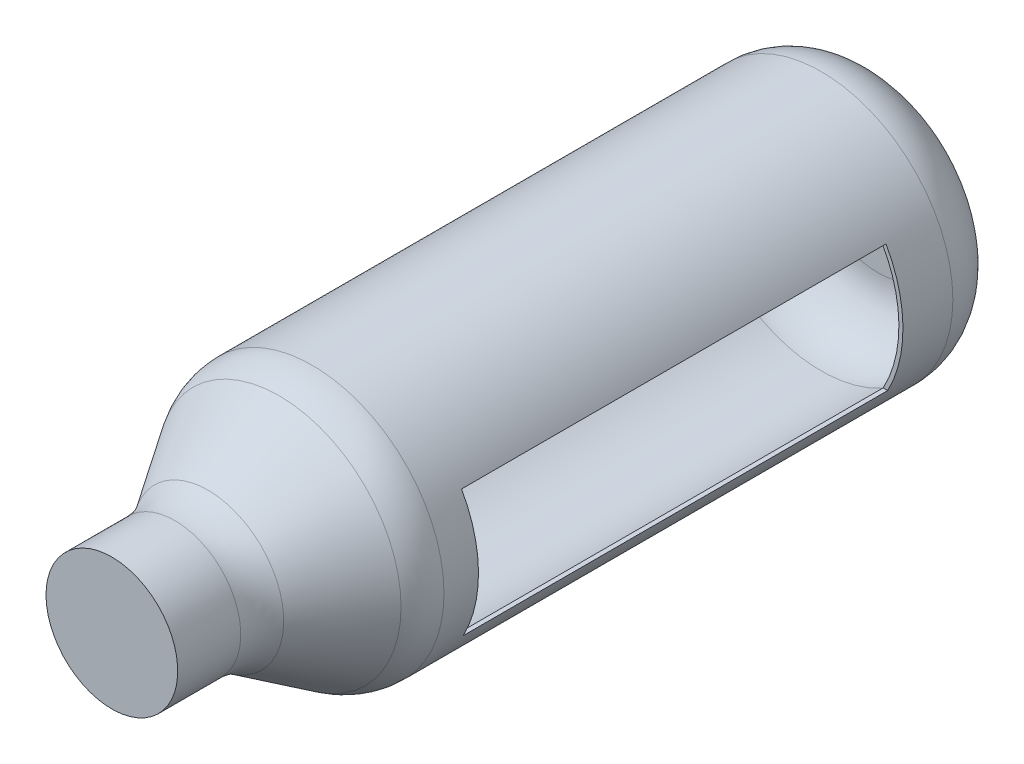
ISO-10303-21;
HEADER;
FILE_DESCRIPTION(('STEP AP214'),'2;1');
FILE_NAME('part.step','',(''),(''),'','','');
FILE_SCHEMA(('AUTOMOTIVE_DESIGN { 1 0 10303 214 1 1 1 1 }'));
ENDSEC;
DATA;
#1=APPLICATION_CONTEXT('core data for automotive mechanical design processes');
#2=APPLICATION_PROTOCOL_DEFINITION('international standard','automotive_design',2000,#1);
#3=PRODUCT_CONTEXT('',#1,'mechanical');
#4=PRODUCT('Part','Part','',(#3));
#5=PRODUCT_RELATED_PRODUCT_CATEGORY('part','',(#4));
#6=PRODUCT_DEFINITION_FORMATION('','',#4);
#7=PRODUCT_DEFINITION_CONTEXT('part definition',#1,'design');
#8=PRODUCT_DEFINITION('design','',#6,#7);
#9=PRODUCT_DEFINITION_SHAPE('','',#8);
#10=(LENGTH_UNIT() NAMED_UNIT(*) SI_UNIT(.MILLI.,.METRE.));
#11=(NAMED_UNIT(*) PLANE_ANGLE_UNIT() SI_UNIT($,.RADIAN.));
#12=(NAMED_UNIT(*) SI_UNIT($,.STERADIAN.) SOLID_ANGLE_UNIT());
#13=UNCERTAINTY_MEASURE_WITH_UNIT(LENGTH_MEASURE(1.E-05),#10,'distance_accuracy_value','');
#14=(GEOMETRIC_REPRESENTATION_CONTEXT(3) GLOBAL_UNCERTAINTY_ASSIGNED_CONTEXT((#13)) GLOBAL_UNIT_ASSIGNED_CONTEXT((#10,
#11,#12)) REPRESENTATION_CONTEXT('',''));
#15=CARTESIAN_POINT('',(0.,0.,0.));
#16=DIRECTION('',(0.,0.,1.));
#17=DIRECTION('',(1.,0.,0.));
#18=AXIS2_PLACEMENT_3D('',#15,#16,#17);
#19=CARTESIAN_POINT('',(0.,15.25,189.));
#20=DIRECTION('',(0.,0.,-1.));
#21=DIRECTION('',(-1.,0.,0.));
#22=AXIS2_PLACEMENT_3D('',#19,#20,#21);
#23=PLANE('',#22);
#24=CARTESIAN_POINT('',(0.,0.,189.));
#25=DIRECTION('',(0.,0.,-1.));
#26=DIRECTION('',(-1.,0.,0.));
#27=AXIS2_PLACEMENT_3D('',#24,#25,#26);
#28=CIRCLE('',#27,15.25);
#29=CARTESIAN_POINT('',(-15.25,0.,189.));
#30=VERTEX_POINT('',#29);
#31=EDGE_CURVE('E120',#30,#30,#28,.T.);
#32=ORIENTED_EDGE('',*,*,#31,.T.);
#33=EDGE_LOOP('',(#32));
#34=FACE_BOUND('',#33,.T.);
#35=ADVANCED_FACE('F39',(#34),#23,.T.);
#36=CARTESIAN_POINT('',(0.,0.,0.));
#37=DIRECTION('',(0.,0.,-1.));
#38=DIRECTION('',(-1.,0.,0.));
#39=AXIS2_PLACEMENT_3D('',#36,#37,#38);
#40=CYLINDRICAL_SURFACE('',#39,15.25);
#41=CARTESIAN_POINT('',(0.,0.,174.446601019715));
#42=DIRECTION('',(0.,0.,-1.));
#43=DIRECTION('',(-1.,0.,0.));
#44=AXIS2_PLACEMENT_3D('',#41,#42,#43);
#45=CIRCLE('',#44,15.25);
#46=CARTESIAN_POINT('',(-15.25,0.,174.446601019715));
#47=VERTEX_POINT('',#46);
#48=EDGE_CURVE('E123',#47,#47,#45,.T.);
#49=ORIENTED_EDGE('',*,*,#48,.T.);
#50=EDGE_LOOP('',(#49));
#51=FACE_BOUND('',#50,.T.);
#52=ORIENTED_EDGE('',*,*,#31,.F.);
#53=EDGE_LOOP('',(#52));
#54=FACE_BOUND('',#53,.T.);
#55=ADVANCED_FACE('F170',(#51,#54),#40,.F.);
#56=CARTESIAN_POINT('',(0.,0.,174.446601019715));
#57=DIRECTION('',(0.,0.,-1.));
#58=DIRECTION('',(-1.,0.,0.));
#59=AXIS2_PLACEMENT_3D('',#56,#57,#58);
#60=TOROIDAL_SURFACE('',#59,31.25,16.);
#61=CARTESIAN_POINT('',(0.,0.,165.726787410188));
#62=DIRECTION('',(0.,0.,-1.));
#63=DIRECTION('',(-1.,0.,0.));
#64=AXIS2_PLACEMENT_3D('',#61,#62,#63);
#65=CIRCLE('',#64,17.8349021391898);
#66=CARTESIAN_POINT('',(-17.8349021391898,0.,165.726787410188));
#67=VERTEX_POINT('',#66);
#68=EDGE_CURVE('E126',#67,#67,#65,.T.);
#69=ORIENTED_EDGE('',*,*,#68,.T.);
#70=EDGE_LOOP('',(#69));
#71=FACE_BOUND('',#70,.T.);
#72=ORIENTED_EDGE('',*,*,#48,.F.);
#73=EDGE_LOOP('',(#72));
#74=FACE_BOUND('',#73,.T.);
#75=ADVANCED_FACE('F177',(#71,#74),#60,.T.);
#76=CARTESIAN_POINT('',(0.,0.,165.726787410188));
#77=DIRECTION('',(0.,0.,-1.));
#78=DIRECTION('',(-1.,0.,0.));
#79=AXIS2_PLACEMENT_3D('',#76,#77,#78);
#80=CONICAL_SURFACE('',#79,17.8349021391898,0.576375220591184);
#81=CARTESIAN_POINT('',(0.,0.,148.183235888621));
#82=DIRECTION('',(0.,0.,-1.));
#83=DIRECTION('',(-1.,0.,0.));
#84=AXIS2_PLACEMENT_3D('',#81,#82,#83);
#85=CIRCLE('',#84,29.2382106282089);
#86=CARTESIAN_POINT('',(-29.2382106282089,0.,148.183235888621));
#87=VERTEX_POINT('',#86);
#88=EDGE_CURVE('E129',#87,#87,#85,.T.);
#89=ORIENTED_EDGE('',*,*,#88,.T.);
#90=EDGE_LOOP('',(#89));
#91=FACE_BOUND('',#90,.T.);
#92=ORIENTED_EDGE('',*,*,#68,.F.);
#93=EDGE_LOOP('',(#92));
#94=FACE_BOUND('',#93,.T.);
#95=ADVANCED_FACE('F232',(#91,#94),#80,.F.);
#96=CARTESIAN_POINT('',(0.,0.,140.553398980285));
#97=DIRECTION('',(0.,0.,-1.));
#98=DIRECTION('',(-1.,0.,0.));
#99=AXIS2_PLACEMENT_3D('',#96,#97,#98);
#100=TOROIDAL_SURFACE('',#99,17.5,14.);
#101=CARTESIAN_POINT('',(0.,0.,140.553398980285));
#102=DIRECTION('',(0.,0.,-1.));
#103=DIRECTION('',(-1.,0.,0.));
#104=AXIS2_PLACEMENT_3D('',#101,#102,#103);
#105=CIRCLE('',#104,31.5);
#106=CARTESIAN_POINT('',(-31.5,0.,140.553398980285));
#107=VERTEX_POINT('',#106);
#108=EDGE_CURVE('E132',#107,#107,#105,.T.);
#109=ORIENTED_EDGE('',*,*,#108,.T.);
#110=EDGE_LOOP('',(#109));
#111=FACE_BOUND('',#110,.T.);
#112=ORIENTED_EDGE('',*,*,#88,.F.);
#113=EDGE_LOOP('',(#112));
#114=FACE_BOUND('',#113,.T.);
#115=ADVANCED_FACE('F229',(#111,#114),#100,.F.);
#116=CARTESIAN_POINT('',(0.,0.,0.));
#117=DIRECTION('',(0.,0.,-1.));
#118=DIRECTION('',(-1.,0.,0.));
#119=AXIS2_PLACEMENT_3D('',#116,#117,#118);
#120=CYLINDRICAL_SURFACE('',#119,31.5);
#121=DIRECTION('',(0.,0.,-1.));
#122=VECTOR('',#121,1.);
#123=CARTESIAN_POINT('',(27.611667283136,-15.1606671965781,0.));
#124=LINE('',#123,#122);
#125=CARTESIAN_POINT('',(27.611667283136,-15.1606671965781,27.3087353676305));
#126=VERTEX_POINT('',#125);
#127=CARTESIAN_POINT('',(27.611667283136,-15.1606671965781,132.040448678337));
#128=VERTEX_POINT('',#127);
#129=EDGE_CURVE('E11',#126,#128,#124,.F.);
#130=ORIENTED_EDGE('',*,*,#129,.F.);
#131=CARTESIAN_POINT('',(0.,0.,27.3087353676305));
#132=DIRECTION('',(0.,0.,-1.));
#133=DIRECTION('',(-1.,0.,0.));
#134=AXIS2_PLACEMENT_3D('',#131,#132,#133);
#135=CIRCLE('',#134,31.5);
#136=CARTESIAN_POINT('',(27.1609707005455,15.9540487213782,27.3087353676305));
#137=VERTEX_POINT('',#136);
#138=EDGE_CURVE('E76',#137,#126,#135,.T.);
#139=ORIENTED_EDGE('',*,*,#138,.F.);
#140=DIRECTION('',(0.,0.,-1.));
#141=VECTOR('',#140,1.);
#142=CARTESIAN_POINT('',(27.1609707005455,15.9540487213782,0.));
#143=LINE('',#142,#141);
#144=CARTESIAN_POINT('',(27.1609707005455,15.9540487213782,132.040448678337));
#145=VERTEX_POINT('',#144);
#146=EDGE_CURVE('E81',#145,#137,#143,.T.);
#147=ORIENTED_EDGE('',*,*,#146,.F.);
#148=CARTESIAN_POINT('',(0.,0.,132.040448678337));
#149=DIRECTION('',(0.,0.,1.));
#150=DIRECTION('',(1.,0.,0.));
#151=AXIS2_PLACEMENT_3D('',#148,#149,#150);
#152=CIRCLE('',#151,31.5);
#153=EDGE_CURVE('E47',#128,#145,#152,.T.);
#154=ORIENTED_EDGE('',*,*,#153,.F.);
#155=EDGE_LOOP('',(#130,#139,#147,#154));
#156=FACE_BOUND('',#155,.T.);
#157=CARTESIAN_POINT('',(0.,0.,15.0000000000001));
#158=DIRECTION('',(0.,0.,-1.));
#159=DIRECTION('',(-1.,0.,0.));
#160=AXIS2_PLACEMENT_3D('',#157,#158,#159);
#161=CIRCLE('',#160,31.5);
#162=CARTESIAN_POINT('',(-31.5,0.,15.0000000000001));
#163=VERTEX_POINT('',#162);
#164=EDGE_CURVE('E135',#163,#163,#161,.T.);
#165=ORIENTED_EDGE('',*,*,#164,.T.);
#166=EDGE_LOOP('',(#165));
#167=FACE_BOUND('',#166,.T.);
#168=ORIENTED_EDGE('',*,*,#108,.F.);
#169=EDGE_LOOP('',(#168));
#170=FACE_BOUND('',#169,.T.);
#171=ADVANCED_FACE('F93',(#156,#167,#170),#120,.F.);
#172=CARTESIAN_POINT('',(0.,0.,15.));
#173=DIRECTION('',(0.,0.,-1.));
#174=DIRECTION('',(-1.,0.,0.));
#175=AXIS2_PLACEMENT_3D('',#172,#173,#174);
#176=TOROIDAL_SURFACE('',#175,17.5,14.);
#177=CARTESIAN_POINT('',(0.,0.,0.999999999999999));
#178=DIRECTION('',(0.,0.,-1.));
#179=DIRECTION('',(-1.,0.,0.));
#180=AXIS2_PLACEMENT_3D('',#177,#178,#179);
#181=CIRCLE('',#180,17.4999999999999);
#182=CARTESIAN_POINT('',(-17.4999999999999,0.,0.999999999999999));
#183=VERTEX_POINT('',#182);
#184=EDGE_CURVE('E138',#183,#183,#181,.T.);
#185=ORIENTED_EDGE('',*,*,#184,.T.);
#186=EDGE_LOOP('',(#185));
#187=FACE_BOUND('',#186,.T.);
#188=ORIENTED_EDGE('',*,*,#164,.F.);
#189=EDGE_LOOP('',(#188));
#190=FACE_BOUND('',#189,.T.);
#191=ADVANCED_FACE('F222',(#187,#190),#176,.F.);
#192=CARTESIAN_POINT('',(0.,0.,1.));
#193=DIRECTION('',(0.,0.,1.));
#194=DIRECTION('',(1.,0.,0.));
#195=AXIS2_PLACEMENT_3D('',#192,#193,#194);
#196=PLANE('',#195);
#197=ORIENTED_EDGE('',*,*,#184,.F.);
#198=EDGE_LOOP('',(#197));
#199=FACE_BOUND('',#198,.T.);
#200=ADVANCED_FACE('F167',(#199),#196,.T.);
#201=CARTESIAN_POINT('',(12.,-15.1606671965781,132.040448678337));
#202=DIRECTION('',(0.,-1.,0.));
#203=DIRECTION('',(0.,0.,-1.));
#204=AXIS2_PLACEMENT_3D('',#201,#202,#203);
#205=PLANE('',#204);
#206=DIRECTION('',(0.,0.,-1.));
#207=VECTOR('',#206,1.);
#208=CARTESIAN_POINT('',(28.747246305596,-15.1606671965781,0.));
#209=LINE('',#208,#207);
#210=CARTESIAN_POINT('',(28.747246305596,-15.1606671965781,132.040448678337));
#211=VERTEX_POINT('',#210);
#212=CARTESIAN_POINT('',(28.747246305596,-15.1606671965781,27.3087353676305));
#213=VERTEX_POINT('',#212);
#214=EDGE_CURVE('E89',#211,#213,#209,.T.);
#215=ORIENTED_EDGE('',*,*,#214,.T.);
#216=DIRECTION('',(1.,0.,0.));
#217=VECTOR('',#216,1.);
#218=CARTESIAN_POINT('',(12.,-15.1606671965781,27.3087353676305));
#219=LINE('',#218,#217);
#220=EDGE_CURVE('E54',#126,#213,#219,.T.);
#221=ORIENTED_EDGE('',*,*,#220,.F.);
#222=ORIENTED_EDGE('',*,*,#129,.T.);
#223=DIRECTION('',(1.,0.,0.));
#224=VECTOR('',#223,1.);
#225=CARTESIAN_POINT('',(12.,-15.1606671965781,132.040448678337));
#226=LINE('',#225,#224);
#227=EDGE_CURVE('E147',#128,#211,#226,.T.);
#228=ORIENTED_EDGE('',*,*,#227,.T.);
#229=EDGE_LOOP('',(#215,#221,#222,#228));
#230=FACE_BOUND('',#229,.T.);
#231=ADVANCED_FACE('F85',(#230),#205,.F.);
#232=CARTESIAN_POINT('',(12.,-15.1606671965781,132.040448678337));
#233=DIRECTION('',(0.,0.,1.));
#234=DIRECTION('',(1.,0.,0.));
#235=AXIS2_PLACEMENT_3D('',#232,#233,#234);
#236=PLANE('',#235);
#237=CARTESIAN_POINT('',(0.,0.,132.040448678337));
#238=DIRECTION('',(0.,0.,1.));
#239=DIRECTION('',(1.,0.,0.));
#240=AXIS2_PLACEMENT_3D('',#237,#238,#239);
#241=CIRCLE('',#240,32.5);
#242=CARTESIAN_POINT('',(28.3146310128861,15.9540487213782,132.040448678337));
#243=VERTEX_POINT('',#242);
#244=EDGE_CURVE('E142',#243,#211,#241,.F.);
#245=ORIENTED_EDGE('',*,*,#244,.T.);
#246=ORIENTED_EDGE('',*,*,#227,.F.);
#247=ORIENTED_EDGE('',*,*,#153,.T.);
#248=DIRECTION('',(1.,0.,0.));
#249=VECTOR('',#248,1.);
#250=CARTESIAN_POINT('',(12.,15.9540487213782,132.040448678337));
#251=LINE('',#250,#249);
#252=EDGE_CURVE('E150',#145,#243,#251,.T.);
#253=ORIENTED_EDGE('',*,*,#252,.T.);
#254=EDGE_LOOP('',(#245,#246,#247,#253));
#255=FACE_BOUND('',#254,.T.);
#256=ADVANCED_FACE('F159',(#255),#236,.F.);
#257=CARTESIAN_POINT('',(12.,15.9540487213782,132.040448678337));
#258=DIRECTION('',(0.,1.,0.));
#259=DIRECTION('',(0.,0.,1.));
#260=AXIS2_PLACEMENT_3D('',#257,#258,#259);
#261=PLANE('',#260);
#262=DIRECTION('',(0.,0.,-1.));
#263=VECTOR('',#262,1.);
#264=CARTESIAN_POINT('',(28.3146310128861,15.9540487213782,0.));
#265=LINE('',#264,#263);
#266=CARTESIAN_POINT('',(28.3146310128861,15.9540487213782,27.3087353676305));
#267=VERTEX_POINT('',#266);
#268=EDGE_CURVE('E144',#267,#243,#265,.F.);
#269=ORIENTED_EDGE('',*,*,#268,.T.);
#270=ORIENTED_EDGE('',*,*,#252,.F.);
#271=ORIENTED_EDGE('',*,*,#146,.T.);
#272=DIRECTION('',(1.,0.,0.));
#273=VECTOR('',#272,1.);
#274=CARTESIAN_POINT('',(12.,15.9540487213782,27.3087353676305));
#275=LINE('',#274,#273);
#276=EDGE_CURVE('E59',#137,#267,#275,.T.);
#277=ORIENTED_EDGE('',*,*,#276,.T.);
#278=EDGE_LOOP('',(#269,#270,#271,#277));
#279=FACE_BOUND('',#278,.T.);
#280=ADVANCED_FACE('F158',(#279),#261,.F.);
#281=CARTESIAN_POINT('',(12.,-15.1606671965781,27.3087353676305));
#282=DIRECTION('',(0.,0.,-1.));
#283=DIRECTION('',(-1.,0.,0.));
#284=AXIS2_PLACEMENT_3D('',#281,#282,#283);
#285=PLANE('',#284);
#286=CARTESIAN_POINT('',(0.,0.,27.3087353676305));
#287=DIRECTION('',(0.,0.,-1.));
#288=DIRECTION('',(-1.,0.,0.));
#289=AXIS2_PLACEMENT_3D('',#286,#287,#288);
#290=CIRCLE('',#289,32.5);
#291=EDGE_CURVE('E146',#213,#267,#290,.F.);
#292=ORIENTED_EDGE('',*,*,#291,.T.);
#293=ORIENTED_EDGE('',*,*,#276,.F.);
#294=ORIENTED_EDGE('',*,*,#138,.T.);
#295=ORIENTED_EDGE('',*,*,#220,.T.);
#296=EDGE_LOOP('',(#292,#293,#294,#295));
#297=FACE_BOUND('',#296,.T.);
#298=ADVANCED_FACE('F77',(#297),#285,.F.);
#299=CARTESIAN_POINT('',(0.,0.,0.));
#300=DIRECTION('',(0.,0.,-1.));
#301=DIRECTION('',(-1.,0.,0.));
#302=AXIS2_PLACEMENT_3D('',#299,#300,#301);
#303=PLANE('',#302);
#304=CARTESIAN_POINT('',(0.,0.,0.));
#305=DIRECTION('',(0.,0.,-1.));
#306=DIRECTION('',(-1.,0.,0.));
#307=AXIS2_PLACEMENT_3D('',#304,#305,#306);
#308=CIRCLE('',#307,17.4999999999999);
#309=CARTESIAN_POINT('',(-17.4999999999999,0.,0.));
#310=VERTEX_POINT('',#309);
#311=EDGE_CURVE('E82',#310,#310,#308,.T.);
#312=ORIENTED_EDGE('',*,*,#311,.T.);
#313=EDGE_LOOP('',(#312));
#314=FACE_BOUND('',#313,.T.);
#315=ADVANCED_FACE('F41',(#314),#303,.T.);
#316=CARTESIAN_POINT('',(0.,0.,15.));
#317=DIRECTION('',(0.,0.,-1.));
#318=DIRECTION('',(-1.,0.,0.));
#319=AXIS2_PLACEMENT_3D('',#316,#317,#318);
#320=TOROIDAL_SURFACE('',#319,17.5,15.);
#321=CARTESIAN_POINT('',(0.,0.,15.0000000000001));
#322=DIRECTION('',(0.,0.,-1.));
#323=DIRECTION('',(-1.,0.,0.));
#324=AXIS2_PLACEMENT_3D('',#321,#322,#323);
#325=CIRCLE('',#324,32.5);
#326=CARTESIAN_POINT('',(-32.5,0.,15.0000000000001));
#327=VERTEX_POINT('',#326);
#328=EDGE_CURVE('E102',#327,#327,#325,.T.);
#329=ORIENTED_EDGE('',*,*,#328,.T.);
#330=EDGE_LOOP('',(#329));
#331=FACE_BOUND('',#330,.T.);
#332=ORIENTED_EDGE('',*,*,#311,.F.);
#333=EDGE_LOOP('',(#332));
#334=FACE_BOUND('',#333,.T.);
#335=ADVANCED_FACE('F202',(#331,#334),#320,.T.);
#336=CARTESIAN_POINT('',(0.,0.,0.));
#337=DIRECTION('',(0.,0.,-1.));
#338=DIRECTION('',(-1.,0.,0.));
#339=AXIS2_PLACEMENT_3D('',#336,#337,#338);
#340=CYLINDRICAL_SURFACE('',#339,32.5);
#341=ORIENTED_EDGE('',*,*,#214,.F.);
#342=ORIENTED_EDGE('',*,*,#244,.F.);
#343=ORIENTED_EDGE('',*,*,#268,.F.);
#344=ORIENTED_EDGE('',*,*,#291,.F.);
#345=EDGE_LOOP('',(#341,#342,#343,#344));
#346=FACE_BOUND('',#345,.T.);
#347=CARTESIAN_POINT('',(0.,0.,140.553398980285));
#348=DIRECTION('',(0.,0.,-1.));
#349=DIRECTION('',(-1.,0.,0.));
#350=AXIS2_PLACEMENT_3D('',#347,#348,#349);
#351=CIRCLE('',#350,32.5);
#352=CARTESIAN_POINT('',(-32.5,0.,140.553398980285));
#353=VERTEX_POINT('',#352);
#354=EDGE_CURVE('E105',#353,#353,#351,.T.);
#355=ORIENTED_EDGE('',*,*,#354,.T.);
#356=EDGE_LOOP('',(#355));
#357=FACE_BOUND('',#356,.T.);
#358=ORIENTED_EDGE('',*,*,#328,.F.);
#359=EDGE_LOOP('',(#358));
#360=FACE_BOUND('',#359,.T.);
#361=ADVANCED_FACE('F154',(#346,#357,#360),#340,.T.);
#362=CARTESIAN_POINT('',(0.,0.,140.553398980285));
#363=DIRECTION('',(0.,0.,-1.));
#364=DIRECTION('',(-1.,0.,0.));
#365=AXIS2_PLACEMENT_3D('',#362,#363,#364);
#366=TOROIDAL_SURFACE('',#365,17.5,15.);
#367=CARTESIAN_POINT('',(0.,0.,148.728224239216));
#368=DIRECTION('',(0.,0.,-1.));
#369=DIRECTION('',(-1.,0.,0.));
#370=AXIS2_PLACEMENT_3D('',#367,#368,#369);
#371=CIRCLE('',#370,30.0766542445095);
#372=CARTESIAN_POINT('',(-30.0766542445095,0.,148.728224239216));
#373=VERTEX_POINT('',#372);
#374=EDGE_CURVE('E108',#373,#373,#371,.T.);
#375=ORIENTED_EDGE('',*,*,#374,.T.);
#376=EDGE_LOOP('',(#375));
#377=FACE_BOUND('',#376,.T.);
#378=ORIENTED_EDGE('',*,*,#354,.F.);
#379=EDGE_LOOP('',(#378));
#380=FACE_BOUND('',#379,.T.);
#381=ADVANCED_FACE('F196',(#377,#380),#366,.T.);
#382=CARTESIAN_POINT('',(0.,0.,148.728224239216));
#383=DIRECTION('',(0.,0.,-1.));
#384=DIRECTION('',(-1.,0.,0.));
#385=AXIS2_PLACEMENT_3D('',#382,#383,#384);
#386=CONICAL_SURFACE('',#385,30.0766542445095,0.576375220591184);
#387=CARTESIAN_POINT('',(0.,0.,166.271775760784));
#388=DIRECTION('',(0.,0.,-1.));
#389=DIRECTION('',(-1.,0.,0.));
#390=AXIS2_PLACEMENT_3D('',#387,#388,#389);
#391=CIRCLE('',#390,18.6733457554905);
#392=CARTESIAN_POINT('',(-18.6733457554905,0.,166.271775760784));
#393=VERTEX_POINT('',#392);
#394=EDGE_CURVE('E111',#393,#393,#391,.T.);
#395=ORIENTED_EDGE('',*,*,#394,.T.);
#396=EDGE_LOOP('',(#395));
#397=FACE_BOUND('',#396,.T.);
#398=ORIENTED_EDGE('',*,*,#374,.F.);
#399=EDGE_LOOP('',(#398));
#400=FACE_BOUND('',#399,.T.);
#401=ADVANCED_FACE('F192',(#397,#400),#386,.T.);
#402=CARTESIAN_POINT('',(0.,0.,174.446601019715));
#403=DIRECTION('',(0.,0.,-1.));
#404=DIRECTION('',(-1.,0.,0.));
#405=AXIS2_PLACEMENT_3D('',#402,#403,#404);
#406=TOROIDAL_SURFACE('',#405,31.25,15.);
#407=CARTESIAN_POINT('',(0.,0.,174.446601019715));
#408=DIRECTION('',(0.,0.,-1.));
#409=DIRECTION('',(-1.,0.,0.));
#410=AXIS2_PLACEMENT_3D('',#407,#408,#409);
#411=CIRCLE('',#410,16.25);
#412=CARTESIAN_POINT('',(-16.25,0.,174.446601019715));
#413=VERTEX_POINT('',#412);
#414=EDGE_CURVE('E114',#413,#413,#411,.T.);
#415=ORIENTED_EDGE('',*,*,#414,.T.);
#416=EDGE_LOOP('',(#415));
#417=FACE_BOUND('',#416,.T.);
#418=ORIENTED_EDGE('',*,*,#394,.F.);
#419=EDGE_LOOP('',(#418));
#420=FACE_BOUND('',#419,.T.);
#421=ADVANCED_FACE('F188',(#417,#420),#406,.F.);
#422=CARTESIAN_POINT('',(0.,0.,0.));
#423=DIRECTION('',(0.,0.,-1.));
#424=DIRECTION('',(-1.,0.,0.));
#425=AXIS2_PLACEMENT_3D('',#422,#423,#424);
#426=CYLINDRICAL_SURFACE('',#425,16.25);
#427=CARTESIAN_POINT('',(0.,0.,190.));
#428=DIRECTION('',(0.,0.,-1.));
#429=DIRECTION('',(-1.,0.,0.));
#430=AXIS2_PLACEMENT_3D('',#427,#428,#429);
#431=CIRCLE('',#430,16.25);
#432=CARTESIAN_POINT('',(-16.25,0.,190.));
#433=VERTEX_POINT('',#432);
#434=EDGE_CURVE('E117',#433,#433,#431,.T.);
#435=ORIENTED_EDGE('',*,*,#434,.T.);
#436=EDGE_LOOP('',(#435));
#437=FACE_BOUND('',#436,.T.);
#438=ORIENTED_EDGE('',*,*,#414,.F.);
#439=EDGE_LOOP('',(#438));
#440=FACE_BOUND('',#439,.T.);
#441=ADVANCED_FACE('F184',(#437,#440),#426,.T.);
#442=CARTESIAN_POINT('',(0.,16.25,190.));
#443=DIRECTION('',(0.,0.,1.));
#444=DIRECTION('',(1.,0.,0.));
#445=AXIS2_PLACEMENT_3D('',#442,#443,#444);
#446=PLANE('',#445);
#447=ORIENTED_EDGE('',*,*,#434,.F.);
#448=EDGE_LOOP('',(#447));
#449=FACE_BOUND('',#448,.T.);
#450=ADVANCED_FACE('F182',(#449),#446,.T.);
#451=CLOSED_SHELL('',(#35,#55,#75,#95,#115,#171,#191,#200,#231,#256,#280,#298,#315,#335,#361,
#381,#401,#421,#441,#450));
#452=MANIFOLD_SOLID_BREP('B2',#451);
#453=ADVANCED_BREP_SHAPE_REPRESENTATION('',(#18,#452),#14);
#454=SHAPE_DEFINITION_REPRESENTATION(#9,#453);
ENDSEC;
END-ISO-10303-21;
